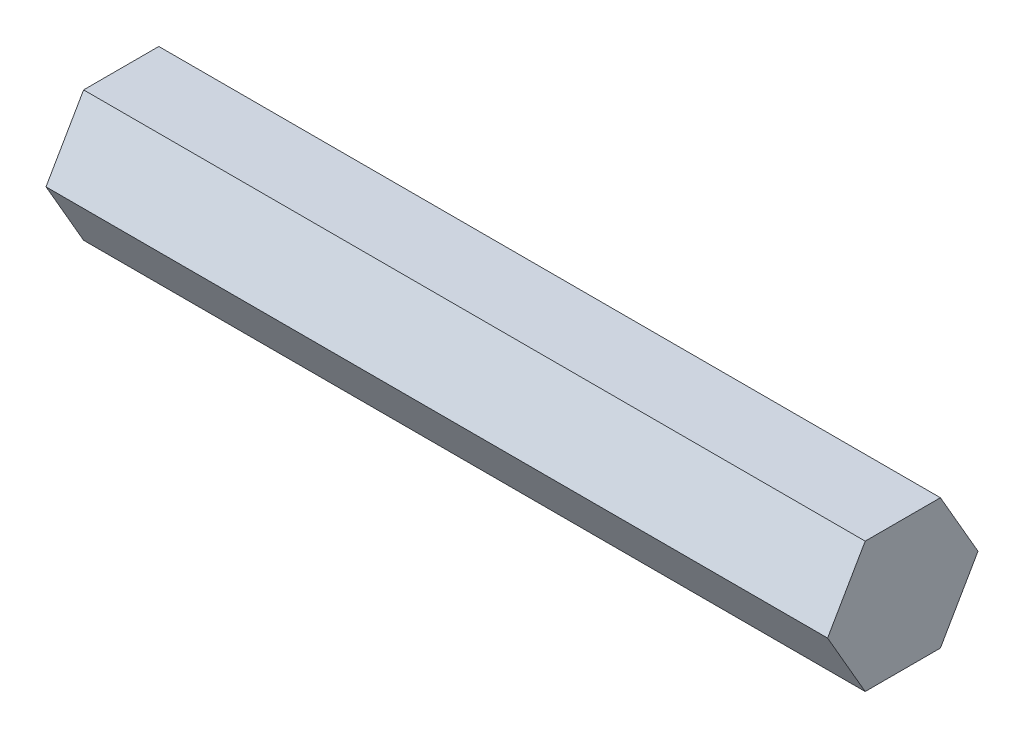
ISO-10303-21;
HEADER;
FILE_DESCRIPTION(('STEP AP214'),'2;1');
FILE_NAME('part.step','',(''),(''),'','','');
FILE_SCHEMA(('AUTOMOTIVE_DESIGN { 1 0 10303 214 1 1 1 1 }'));
ENDSEC;
DATA;
#1=APPLICATION_CONTEXT('core data for automotive mechanical design processes');
#2=APPLICATION_PROTOCOL_DEFINITION('international standard','automotive_design',2000,#1);
#3=PRODUCT_CONTEXT('',#1,'mechanical');
#4=PRODUCT('Part','Part','',(#3));
#5=PRODUCT_RELATED_PRODUCT_CATEGORY('part','',(#4));
#6=PRODUCT_DEFINITION_FORMATION('','',#4);
#7=PRODUCT_DEFINITION_CONTEXT('part definition',#1,'design');
#8=PRODUCT_DEFINITION('design','',#6,#7);
#9=PRODUCT_DEFINITION_SHAPE('','',#8);
#10=(LENGTH_UNIT() NAMED_UNIT(*) SI_UNIT(.MILLI.,.METRE.));
#11=(NAMED_UNIT(*) PLANE_ANGLE_UNIT() SI_UNIT($,.RADIAN.));
#12=(NAMED_UNIT(*) SI_UNIT($,.STERADIAN.) SOLID_ANGLE_UNIT());
#13=UNCERTAINTY_MEASURE_WITH_UNIT(LENGTH_MEASURE(1.E-05),#10,'distance_accuracy_value','');
#14=(GEOMETRIC_REPRESENTATION_CONTEXT(3) GLOBAL_UNCERTAINTY_ASSIGNED_CONTEXT((#13)) GLOBAL_UNIT_ASSIGNED_CONTEXT((#10,
#11,#12)) REPRESENTATION_CONTEXT('',''));
#15=CARTESIAN_POINT('',(0.,0.,0.));
#16=DIRECTION('',(0.,0.,1.));
#17=DIRECTION('',(1.,0.,0.));
#18=AXIS2_PLACEMENT_3D('',#15,#16,#17);
#19=CARTESIAN_POINT('',(76.2,6.34999999999996,3.6661742093542));
#20=DIRECTION('',(0.,-0.499999999999995,-0.866025403784442));
#21=DIRECTION('',(0.,0.866025403784442,-0.499999999999995));
#22=AXIS2_PLACEMENT_3D('',#19,#20,#21);
#23=PLANE('',#22);
#24=DIRECTION('',(0.,-0.866025403784442,0.499999999999995));
#25=VECTOR('',#24,1.);
#26=CARTESIAN_POINT('',(0.,6.34999999999996,3.6661742093542));
#27=LINE('',#26,#25);
#28=CARTESIAN_POINT('',(0.,6.34999999999996,3.6661742093542));
#29=VERTEX_POINT('',#28);
#30=CARTESIAN_POINT('',(0.,0.,7.33234841870825));
#31=VERTEX_POINT('',#30);
#32=EDGE_CURVE('E135',#29,#31,#27,.T.);
#33=ORIENTED_EDGE('',*,*,#32,.T.);
#34=DIRECTION('',(-1.,0.,0.));
#35=VECTOR('',#34,1.);
#36=CARTESIAN_POINT('',(76.2,0.,7.33234841870825));
#37=LINE('',#36,#35);
#38=CARTESIAN_POINT('',(76.2,0.,7.33234841870825));
#39=VERTEX_POINT('',#38);
#40=EDGE_CURVE('E11',#39,#31,#37,.T.);
#41=ORIENTED_EDGE('',*,*,#40,.F.);
#42=DIRECTION('',(0.,-0.866025403784442,0.499999999999995));
#43=VECTOR('',#42,1.);
#44=CARTESIAN_POINT('',(76.2,6.34999999999996,3.6661742093542));
#45=LINE('',#44,#43);
#46=CARTESIAN_POINT('',(76.2,6.34999999999996,3.6661742093542));
#47=VERTEX_POINT('',#46);
#48=EDGE_CURVE('E147',#47,#39,#45,.T.);
#49=ORIENTED_EDGE('',*,*,#48,.F.);
#50=DIRECTION('',(-1.,0.,0.));
#51=VECTOR('',#50,1.);
#52=CARTESIAN_POINT('',(76.2,6.34999999999996,3.6661742093542));
#53=LINE('',#52,#51);
#54=EDGE_CURVE('E131',#47,#29,#53,.T.);
#55=ORIENTED_EDGE('',*,*,#54,.T.);
#56=EDGE_LOOP('',(#33,#41,#49,#55));
#57=FACE_BOUND('',#56,.T.);
#58=ADVANCED_FACE('F39',(#57),#23,.F.);
#59=CARTESIAN_POINT('',(76.2,0.,7.33234841870825));
#60=DIRECTION('',(0.,0.500000000000001,-0.866025403784438));
#61=DIRECTION('',(0.,0.866025403784438,0.500000000000001));
#62=AXIS2_PLACEMENT_3D('',#59,#60,#61);
#63=PLANE('',#62);
#64=DIRECTION('',(0.,-0.866025403784438,-0.500000000000001));
#65=VECTOR('',#64,1.);
#66=CARTESIAN_POINT('',(0.,0.,7.33234841870825));
#67=LINE('',#66,#65);
#68=CARTESIAN_POINT('',(0.,-6.35000000000001,3.66617420935411));
#69=VERTEX_POINT('',#68);
#70=EDGE_CURVE('E138',#31,#69,#67,.T.);
#71=ORIENTED_EDGE('',*,*,#70,.T.);
#72=DIRECTION('',(-1.,0.,0.));
#73=VECTOR('',#72,1.);
#74=CARTESIAN_POINT('',(76.2,-6.35000000000001,3.66617420935411));
#75=LINE('',#74,#73);
#76=CARTESIAN_POINT('',(76.2,-6.35000000000001,3.66617420935411));
#77=VERTEX_POINT('',#76);
#78=EDGE_CURVE('E48',#77,#69,#75,.T.);
#79=ORIENTED_EDGE('',*,*,#78,.F.);
#80=DIRECTION('',(0.,-0.866025403784438,-0.500000000000001));
#81=VECTOR('',#80,1.);
#82=CARTESIAN_POINT('',(76.2,0.,7.33234841870825));
#83=LINE('',#82,#81);
#84=EDGE_CURVE('E99',#39,#77,#83,.T.);
#85=ORIENTED_EDGE('',*,*,#84,.F.);
#86=ORIENTED_EDGE('',*,*,#40,.T.);
#87=EDGE_LOOP('',(#71,#79,#85,#86));
#88=FACE_BOUND('',#87,.T.);
#89=ADVANCED_FACE('F175',(#88),#63,.F.);
#90=CARTESIAN_POINT('',(76.2,-6.35000000000001,3.66617420935411));
#91=DIRECTION('',(0.,1.,0.));
#92=DIRECTION('',(0.,0.,1.));
#93=AXIS2_PLACEMENT_3D('',#90,#91,#92);
#94=PLANE('',#93);
#95=DIRECTION('',(0.,0.,-1.));
#96=VECTOR('',#95,1.);
#97=CARTESIAN_POINT('',(0.,-6.35000000000001,3.66617420935411));
#98=LINE('',#97,#96);
#99=CARTESIAN_POINT('',(0.,-6.34999999999999,-3.66617420935416));
#100=VERTEX_POINT('',#99);
#101=EDGE_CURVE('E140',#69,#100,#98,.T.);
#102=ORIENTED_EDGE('',*,*,#101,.T.);
#103=DIRECTION('',(-1.,0.,0.));
#104=VECTOR('',#103,1.);
#105=CARTESIAN_POINT('',(76.2,-6.34999999999999,-3.66617420935416));
#106=LINE('',#105,#104);
#107=CARTESIAN_POINT('',(76.2,-6.34999999999999,-3.66617420935416));
#108=VERTEX_POINT('',#107);
#109=EDGE_CURVE('E124',#108,#100,#106,.T.);
#110=ORIENTED_EDGE('',*,*,#109,.F.);
#111=DIRECTION('',(0.,0.,-1.));
#112=VECTOR('',#111,1.);
#113=CARTESIAN_POINT('',(76.2,-6.35000000000001,3.66617420935411));
#114=LINE('',#113,#112);
#115=EDGE_CURVE('E113',#77,#108,#114,.T.);
#116=ORIENTED_EDGE('',*,*,#115,.F.);
#117=ORIENTED_EDGE('',*,*,#78,.T.);
#118=EDGE_LOOP('',(#102,#110,#116,#117));
#119=FACE_BOUND('',#118,.T.);
#120=ADVANCED_FACE('F157',(#119),#94,.F.);
#121=CARTESIAN_POINT('',(76.2,-6.34999999999999,-3.66617420935416));
#122=DIRECTION('',(0.,0.499999999999995,0.866025403784442));
#123=DIRECTION('',(0.,-0.866025403784442,0.499999999999995));
#124=AXIS2_PLACEMENT_3D('',#121,#122,#123);
#125=PLANE('',#124);
#126=DIRECTION('',(0.,0.866025403784442,-0.499999999999995));
#127=VECTOR('',#126,1.);
#128=CARTESIAN_POINT('',(0.,-6.34999999999999,-3.66617420935416));
#129=LINE('',#128,#127);
#130=CARTESIAN_POINT('',(0.,0.,-7.33234841870825));
#131=VERTEX_POINT('',#130);
#132=EDGE_CURVE('E122',#100,#131,#129,.T.);
#133=ORIENTED_EDGE('',*,*,#132,.T.);
#134=DIRECTION('',(-1.,0.,0.));
#135=VECTOR('',#134,1.);
#136=CARTESIAN_POINT('',(76.2,0.,-7.33234841870825));
#137=LINE('',#136,#135);
#138=CARTESIAN_POINT('',(76.2,0.,-7.33234841870825));
#139=VERTEX_POINT('',#138);
#140=EDGE_CURVE('E119',#139,#131,#137,.T.);
#141=ORIENTED_EDGE('',*,*,#140,.F.);
#142=DIRECTION('',(0.,0.866025403784442,-0.499999999999995));
#143=VECTOR('',#142,1.);
#144=CARTESIAN_POINT('',(76.2,-6.34999999999999,-3.66617420935416));
#145=LINE('',#144,#143);
#146=EDGE_CURVE('E107',#108,#139,#145,.T.);
#147=ORIENTED_EDGE('',*,*,#146,.F.);
#148=ORIENTED_EDGE('',*,*,#109,.T.);
#149=EDGE_LOOP('',(#133,#141,#147,#148));
#150=FACE_BOUND('',#149,.T.);
#151=ADVANCED_FACE('F120',(#150),#125,.F.);
#152=CARTESIAN_POINT('',(76.2,0.,-7.33234841870825));
#153=DIRECTION('',(0.,-0.500000000000007,0.866025403784435));
#154=DIRECTION('',(0.,-0.866025403784435,-0.500000000000007));
#155=AXIS2_PLACEMENT_3D('',#152,#153,#154);
#156=PLANE('',#155);
#157=DIRECTION('',(0.,0.866025403784435,0.500000000000007));
#158=VECTOR('',#157,1.);
#159=CARTESIAN_POINT('',(0.,0.,-7.33234841870825));
#160=LINE('',#159,#158);
#161=CARTESIAN_POINT('',(0.,6.35000000000004,-3.66617420935407));
#162=VERTEX_POINT('',#161);
#163=EDGE_CURVE('E83',#131,#162,#160,.T.);
#164=ORIENTED_EDGE('',*,*,#163,.T.);
#165=DIRECTION('',(-1.,0.,0.));
#166=VECTOR('',#165,1.);
#167=CARTESIAN_POINT('',(76.2,6.35000000000004,-3.66617420935407));
#168=LINE('',#167,#166);
#169=CARTESIAN_POINT('',(76.2,6.35000000000004,-3.66617420935407));
#170=VERTEX_POINT('',#169);
#171=EDGE_CURVE('E125',#170,#162,#168,.T.);
#172=ORIENTED_EDGE('',*,*,#171,.F.);
#173=DIRECTION('',(0.,0.866025403784435,0.500000000000007));
#174=VECTOR('',#173,1.);
#175=CARTESIAN_POINT('',(76.2,0.,-7.33234841870825));
#176=LINE('',#175,#174);
#177=EDGE_CURVE('E111',#139,#170,#176,.T.);
#178=ORIENTED_EDGE('',*,*,#177,.F.);
#179=ORIENTED_EDGE('',*,*,#140,.T.);
#180=EDGE_LOOP('',(#164,#172,#178,#179));
#181=FACE_BOUND('',#180,.T.);
#182=ADVANCED_FACE('F127',(#181),#156,.F.);
#183=CARTESIAN_POINT('',(76.2,6.35000000000004,-3.66617420935407));
#184=DIRECTION('',(0.,-1.,0.));
#185=DIRECTION('',(0.,0.,-1.));
#186=AXIS2_PLACEMENT_3D('',#183,#184,#185);
#187=PLANE('',#186);
#188=DIRECTION('',(0.,0.,1.));
#189=VECTOR('',#188,1.);
#190=CARTESIAN_POINT('',(0.,6.35000000000004,-3.66617420935407));
#191=LINE('',#190,#189);
#192=EDGE_CURVE('E89',#162,#29,#191,.T.);
#193=ORIENTED_EDGE('',*,*,#192,.T.);
#194=ORIENTED_EDGE('',*,*,#54,.F.);
#195=DIRECTION('',(0.,0.,1.));
#196=VECTOR('',#195,1.);
#197=CARTESIAN_POINT('',(76.2,6.35000000000004,-3.66617420935407));
#198=LINE('',#197,#196);
#199=EDGE_CURVE('E59',#170,#47,#198,.T.);
#200=ORIENTED_EDGE('',*,*,#199,.F.);
#201=ORIENTED_EDGE('',*,*,#171,.T.);
#202=EDGE_LOOP('',(#193,#194,#200,#201));
#203=FACE_BOUND('',#202,.T.);
#204=ADVANCED_FACE('F164',(#203),#187,.F.);
#205=CARTESIAN_POINT('',(76.2,0.,0.));
#206=DIRECTION('',(1.,0.,0.));
#207=DIRECTION('',(0.,0.,-1.));
#208=AXIS2_PLACEMENT_3D('',#205,#206,#207);
#209=PLANE('',#208);
#210=ORIENTED_EDGE('',*,*,#48,.T.);
#211=ORIENTED_EDGE('',*,*,#84,.T.);
#212=ORIENTED_EDGE('',*,*,#115,.T.);
#213=ORIENTED_EDGE('',*,*,#146,.T.);
#214=ORIENTED_EDGE('',*,*,#177,.T.);
#215=ORIENTED_EDGE('',*,*,#199,.T.);
#216=EDGE_LOOP('',(#210,#211,#212,#213,#214,#215));
#217=FACE_BOUND('',#216,.T.);
#218=ADVANCED_FACE('F109',(#217),#209,.T.);
#219=CARTESIAN_POINT('',(0.,0.,0.));
#220=DIRECTION('',(1.,0.,0.));
#221=DIRECTION('',(0.,0.,-1.));
#222=AXIS2_PLACEMENT_3D('',#219,#220,#221);
#223=PLANE('',#222);
#224=ORIENTED_EDGE('',*,*,#32,.F.);
#225=ORIENTED_EDGE('',*,*,#192,.F.);
#226=ORIENTED_EDGE('',*,*,#163,.F.);
#227=ORIENTED_EDGE('',*,*,#132,.F.);
#228=ORIENTED_EDGE('',*,*,#101,.F.);
#229=ORIENTED_EDGE('',*,*,#70,.F.);
#230=EDGE_LOOP('',(#224,#225,#226,#227,#228,#229));
#231=FACE_BOUND('',#230,.T.);
#232=ADVANCED_FACE('F160',(#231),#223,.F.);
#233=CLOSED_SHELL('',(#58,#89,#120,#151,#182,#204,#218,#232));
#234=MANIFOLD_SOLID_BREP('B2',#233);
#235=ADVANCED_BREP_SHAPE_REPRESENTATION('',(#18,#234),#14);
#236=SHAPE_DEFINITION_REPRESENTATION(#9,#235);
ENDSEC;
END-ISO-10303-21;
